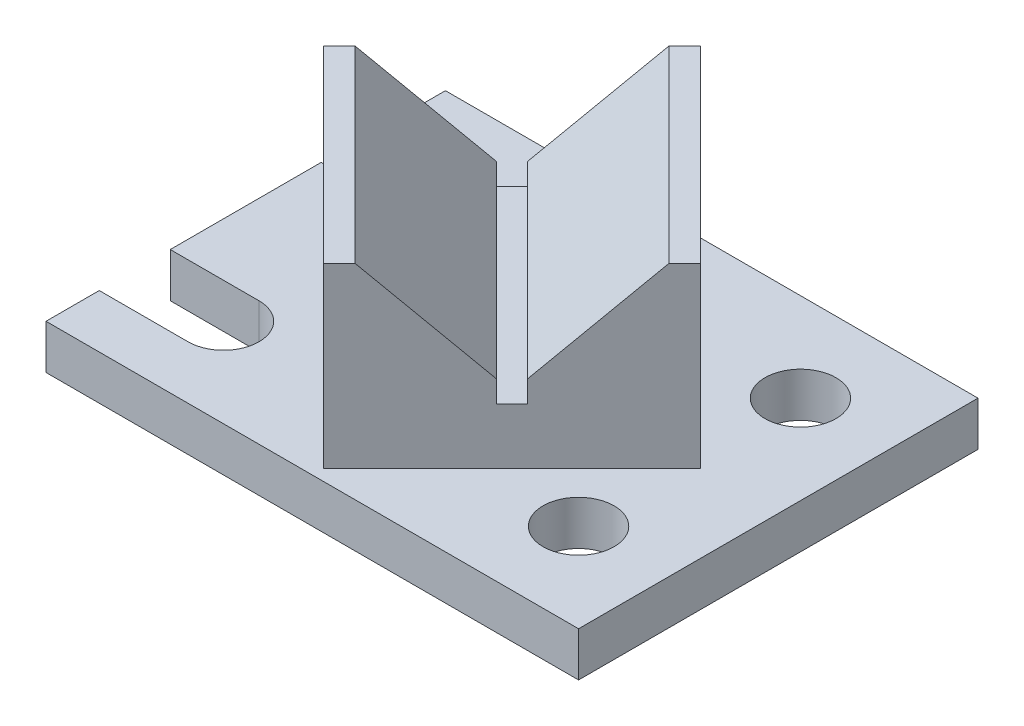
ISO-10303-21;
HEADER;
FILE_DESCRIPTION(('STEP AP214'),'2;1');
FILE_NAME('part.step','',(''),(''),'','','');
FILE_SCHEMA(('AUTOMOTIVE_DESIGN { 1 0 10303 214 1 1 1 1 }'));
ENDSEC;
DATA;
#1=APPLICATION_CONTEXT('core data for automotive mechanical design processes');
#2=APPLICATION_PROTOCOL_DEFINITION('international standard','automotive_design',2000,#1);
#3=PRODUCT_CONTEXT('',#1,'mechanical');
#4=PRODUCT('Part','Part','',(#3));
#5=PRODUCT_RELATED_PRODUCT_CATEGORY('part','',(#4));
#6=PRODUCT_DEFINITION_FORMATION('','',#4);
#7=PRODUCT_DEFINITION_CONTEXT('part definition',#1,'design');
#8=PRODUCT_DEFINITION('design','',#6,#7);
#9=PRODUCT_DEFINITION_SHAPE('','',#8);
#10=(LENGTH_UNIT() NAMED_UNIT(*) SI_UNIT(.MILLI.,.METRE.));
#11=(NAMED_UNIT(*) PLANE_ANGLE_UNIT() SI_UNIT($,.RADIAN.));
#12=(NAMED_UNIT(*) SI_UNIT($,.STERADIAN.) SOLID_ANGLE_UNIT());
#13=UNCERTAINTY_MEASURE_WITH_UNIT(LENGTH_MEASURE(1.E-05),#10,'distance_accuracy_value','');
#14=(GEOMETRIC_REPRESENTATION_CONTEXT(3) GLOBAL_UNCERTAINTY_ASSIGNED_CONTEXT((#13)) GLOBAL_UNIT_ASSIGNED_CONTEXT((#10,
#11,#12)) REPRESENTATION_CONTEXT('',''));
#15=CARTESIAN_POINT('',(0.,0.,0.));
#16=DIRECTION('',(0.,0.,1.));
#17=DIRECTION('',(1.,0.,0.));
#18=AXIS2_PLACEMENT_3D('',#15,#16,#17);
#19=CARTESIAN_POINT('',(0.,63.5,0.));
#20=DIRECTION('',(0.,-1.,0.));
#21=DIRECTION('',(0.,0.,-1.));
#22=AXIS2_PLACEMENT_3D('',#19,#20,#21);
#23=PLANE('',#22);
#24=DIRECTION('',(0.707106781186546,0.,-0.707106781186549));
#25=VECTOR('',#24,1.);
#26=CARTESIAN_POINT('',(1.04083408558608E-13,63.5,53.8815367264149));
#27=LINE('',#26,#25);
#28=CARTESIAN_POINT('',(1.04083408558608E-13,63.5,53.8815367264149));
#29=VERTEX_POINT('',#28);
#30=CARTESIAN_POINT('',(4.49012806053468,63.5,49.3914086658803));
#31=VERTEX_POINT('',#30);
#32=EDGE_CURVE('E246',#29,#31,#27,.T.);
#33=ORIENTED_EDGE('',*,*,#32,.T.);
#34=DIRECTION('',(-0.707106781186549,0.,-0.707106781186546));
#35=VECTOR('',#34,1.);
#36=CARTESIAN_POINT('',(-22.4506403026728,63.5,22.4506403026729));
#37=LINE('',#36,#35);
#38=CARTESIAN_POINT('',(-49.3914086658803,63.5,-4.4901280605345));
#39=VERTEX_POINT('',#38);
#40=EDGE_CURVE('E11',#31,#39,#37,.T.);
#41=ORIENTED_EDGE('',*,*,#40,.T.);
#42=DIRECTION('',(-0.707106781186546,0.,0.707106781186549));
#43=VECTOR('',#42,1.);
#44=CARTESIAN_POINT('',(-53.8815367264149,63.5,0.));
#45=LINE('',#44,#43);
#46=CARTESIAN_POINT('',(-53.8815367264149,63.5,0.));
#47=VERTEX_POINT('',#46);
#48=EDGE_CURVE('E238',#39,#47,#45,.T.);
#49=ORIENTED_EDGE('',*,*,#48,.T.);
#50=DIRECTION('',(0.707106781186549,0.,0.707106781186546));
#51=VECTOR('',#50,1.);
#52=CARTESIAN_POINT('',(1.04083408558608E-13,63.5,53.8815367264149));
#53=LINE('',#52,#51);
#54=EDGE_CURVE('E243',#47,#29,#53,.T.);
#55=ORIENTED_EDGE('',*,*,#54,.T.);
#56=EDGE_LOOP('',(#33,#41,#49,#55));
#57=FACE_BOUND('',#56,.T.);
#58=ADVANCED_FACE('F39',(#57),#23,.F.);
#59=CARTESIAN_POINT('',(0.,12.7,0.));
#60=DIRECTION('',(0.,-1.,0.));
#61=DIRECTION('',(0.,0.,-1.));
#62=AXIS2_PLACEMENT_3D('',#59,#60,#61);
#63=PLANE('',#62);
#64=CARTESIAN_POINT('',(50.8,12.7,-31.75));
#65=DIRECTION('',(0.,-1.,0.));
#66=DIRECTION('',(0.,0.,-1.));
#67=AXIS2_PLACEMENT_3D('',#64,#65,#66);
#68=CIRCLE('',#67,10.16);
#69=CARTESIAN_POINT('',(50.8,12.7,-41.91));
#70=VERTEX_POINT('',#69);
#71=EDGE_CURVE('E274',#70,#70,#68,.T.);
#72=ORIENTED_EDGE('',*,*,#71,.T.);
#73=EDGE_LOOP('',(#72));
#74=FACE_BOUND('',#73,.T.);
#75=DIRECTION('',(1.,0.,0.));
#76=VECTOR('',#75,1.);
#77=CARTESIAN_POINT('',(-76.2,12.7,-41.91));
#78=LINE('',#77,#76);
#79=CARTESIAN_POINT('',(-76.2,12.7,-41.91));
#80=VERTEX_POINT('',#79);
#81=CARTESIAN_POINT('',(-50.8,12.7,-41.91));
#82=VERTEX_POINT('',#81);
#83=EDGE_CURVE('E281',#80,#82,#78,.T.);
#84=ORIENTED_EDGE('',*,*,#83,.T.);
#85=CARTESIAN_POINT('',(-50.8,12.7,-31.75));
#86=DIRECTION('',(0.,-1.,0.));
#87=DIRECTION('',(0.,0.,1.));
#88=AXIS2_PLACEMENT_3D('',#85,#86,#87);
#89=CIRCLE('',#88,10.16);
#90=CARTESIAN_POINT('',(-50.8,12.7,-21.59));
#91=VERTEX_POINT('',#90);
#92=EDGE_CURVE('E289',#82,#91,#89,.T.);
#93=ORIENTED_EDGE('',*,*,#92,.T.);
#94=DIRECTION('',(-1.,0.,0.));
#95=VECTOR('',#94,1.);
#96=CARTESIAN_POINT('',(-76.2,12.7,-21.59));
#97=LINE('',#96,#95);
#98=CARTESIAN_POINT('',(-76.2,12.7,-21.59));
#99=VERTEX_POINT('',#98);
#100=EDGE_CURVE('E269',#91,#99,#97,.T.);
#101=ORIENTED_EDGE('',*,*,#100,.T.);
#102=DIRECTION('',(0.,0.,1.));
#103=VECTOR('',#102,1.);
#104=CARTESIAN_POINT('',(-76.2,12.7,57.15));
#105=LINE('',#104,#103);
#106=CARTESIAN_POINT('',(-76.2,12.7,21.59));
#107=VERTEX_POINT('',#106);
#108=EDGE_CURVE('E345',#99,#107,#105,.T.);
#109=ORIENTED_EDGE('',*,*,#108,.T.);
#110=DIRECTION('',(-1.,0.,0.));
#111=VECTOR('',#110,1.);
#112=CARTESIAN_POINT('',(-76.2,12.7,21.59));
#113=LINE('',#112,#111);
#114=CARTESIAN_POINT('',(-50.8,12.7,21.59));
#115=VERTEX_POINT('',#114);
#116=EDGE_CURVE('E318',#115,#107,#113,.T.);
#117=ORIENTED_EDGE('',*,*,#116,.F.);
#118=CARTESIAN_POINT('',(-50.8,12.7,31.75));
#119=DIRECTION('',(0.,1.,0.));
#120=DIRECTION('',(0.,0.,-1.));
#121=AXIS2_PLACEMENT_3D('',#118,#119,#120);
#122=CIRCLE('',#121,10.16);
#123=CARTESIAN_POINT('',(-50.8,12.7,41.91));
#124=VERTEX_POINT('',#123);
#125=EDGE_CURVE('E321',#124,#115,#122,.T.);
#126=ORIENTED_EDGE('',*,*,#125,.F.);
#127=DIRECTION('',(1.,0.,0.));
#128=VECTOR('',#127,1.);
#129=CARTESIAN_POINT('',(-76.2,12.7,41.91));
#130=LINE('',#129,#128);
#131=CARTESIAN_POINT('',(-76.2,12.7,41.91));
#132=VERTEX_POINT('',#131);
#133=EDGE_CURVE('E308',#132,#124,#130,.T.);
#134=ORIENTED_EDGE('',*,*,#133,.F.);
#135=CARTESIAN_POINT('',(-76.2,12.7,57.15));
#136=VERTEX_POINT('',#135);
#137=EDGE_CURVE('E340',#132,#136,#105,.T.);
#138=ORIENTED_EDGE('',*,*,#137,.T.);
#139=DIRECTION('',(1.,0.,0.));
#140=VECTOR('',#139,1.);
#141=CARTESIAN_POINT('',(-76.2,12.7,57.15));
#142=LINE('',#141,#140);
#143=CARTESIAN_POINT('',(76.2,12.7,57.15));
#144=VERTEX_POINT('',#143);
#145=EDGE_CURVE('E344',#136,#144,#142,.T.);
#146=ORIENTED_EDGE('',*,*,#145,.T.);
#147=DIRECTION('',(0.,0.,-1.));
#148=VECTOR('',#147,1.);
#149=CARTESIAN_POINT('',(76.2,12.7,57.15));
#150=LINE('',#149,#148);
#151=CARTESIAN_POINT('',(76.2,12.7,-57.15));
#152=VERTEX_POINT('',#151);
#153=EDGE_CURVE('E334',#144,#152,#150,.T.);
#154=ORIENTED_EDGE('',*,*,#153,.T.);
#155=DIRECTION('',(-1.,0.,0.));
#156=VECTOR('',#155,1.);
#157=CARTESIAN_POINT('',(-76.2,12.7,-57.15));
#158=LINE('',#157,#156);
#159=CARTESIAN_POINT('',(-76.2,12.7,-57.15));
#160=VERTEX_POINT('',#159);
#161=EDGE_CURVE('E337',#152,#160,#158,.T.);
#162=ORIENTED_EDGE('',*,*,#161,.T.);
#163=EDGE_CURVE('E341',#160,#80,#105,.T.);
#164=ORIENTED_EDGE('',*,*,#163,.T.);
#165=EDGE_LOOP('',(#84,#93,#101,#109,#117,#126,#134,#138,#146,#154,#162,#164));
#166=FACE_BOUND('',#165,.T.);
#167=CARTESIAN_POINT('',(50.8,12.7,31.75));
#168=DIRECTION('',(0.,1.,0.));
#169=DIRECTION('',(0.,0.,1.));
#170=AXIS2_PLACEMENT_3D('',#167,#168,#169);
#171=CIRCLE('',#170,10.16);
#172=CARTESIAN_POINT('',(50.8,12.7,41.91));
#173=VERTEX_POINT('',#172);
#174=EDGE_CURVE('E305',#173,#173,#171,.T.);
#175=ORIENTED_EDGE('',*,*,#174,.F.);
#176=EDGE_LOOP('',(#175));
#177=FACE_BOUND('',#176,.T.);
#178=DIRECTION('',(-0.707106781186549,0.,-0.707106781186546));
#179=VECTOR('',#178,1.);
#180=CARTESIAN_POINT('',(53.8815367264149,12.7,0.));
#181=LINE('',#180,#179);
#182=CARTESIAN_POINT('',(53.8815367264149,12.7,0.));
#183=VERTEX_POINT('',#182);
#184=CARTESIAN_POINT('',(0.,12.7,-53.8815367264149));
#185=VERTEX_POINT('',#184);
#186=EDGE_CURVE('E62',#183,#185,#181,.T.);
#187=ORIENTED_EDGE('',*,*,#186,.F.);
#188=DIRECTION('',(0.707106781186546,0.,-0.707106781186549));
#189=VECTOR('',#188,1.);
#190=CARTESIAN_POINT('',(1.04083408558608E-13,12.7,53.8815367264149));
#191=LINE('',#190,#189);
#192=CARTESIAN_POINT('',(1.04083408558608E-13,12.7,53.8815367264149));
#193=VERTEX_POINT('',#192);
#194=EDGE_CURVE('E239',#193,#183,#191,.T.);
#195=ORIENTED_EDGE('',*,*,#194,.F.);
#196=DIRECTION('',(0.707106781186549,0.,0.707106781186546));
#197=VECTOR('',#196,1.);
#198=CARTESIAN_POINT('',(1.04083408558608E-13,12.7,53.8815367264149));
#199=LINE('',#198,#197);
#200=CARTESIAN_POINT('',(-53.8815367264149,12.7,0.));
#201=VERTEX_POINT('',#200);
#202=EDGE_CURVE('E254',#201,#193,#199,.T.);
#203=ORIENTED_EDGE('',*,*,#202,.F.);
#204=DIRECTION('',(-0.707106781186546,0.,0.707106781186549));
#205=VECTOR('',#204,1.);
#206=CARTESIAN_POINT('',(-53.8815367264149,12.7,0.));
#207=LINE('',#206,#205);
#208=EDGE_CURVE('E251',#185,#201,#207,.T.);
#209=ORIENTED_EDGE('',*,*,#208,.F.);
#210=EDGE_LOOP('',(#187,#195,#203,#209));
#211=FACE_BOUND('',#210,.T.);
#212=ADVANCED_FACE('F392',(#74,#166,#177,#211),#63,.F.);
#213=CARTESIAN_POINT('',(-76.2,12.7,57.15));
#214=DIRECTION('',(1.,0.,0.));
#215=DIRECTION('',(0.,0.,-1.));
#216=AXIS2_PLACEMENT_3D('',#213,#214,#215);
#217=PLANE('',#216);
#218=DIRECTION('',(0.,1.,0.));
#219=VECTOR('',#218,1.);
#220=CARTESIAN_POINT('',(-76.2,0.,-41.91));
#221=LINE('',#220,#219);
#222=CARTESIAN_POINT('',(-76.2,0.,-41.91));
#223=VERTEX_POINT('',#222);
#224=EDGE_CURVE('E277',#223,#80,#221,.T.);
#225=ORIENTED_EDGE('',*,*,#224,.T.);
#226=ORIENTED_EDGE('',*,*,#163,.F.);
#227=DIRECTION('',(0.,-1.,0.));
#228=VECTOR('',#227,1.);
#229=CARTESIAN_POINT('',(-76.2,12.7,-57.15));
#230=LINE('',#229,#228);
#231=CARTESIAN_POINT('',(-76.2,0.,-57.15));
#232=VERTEX_POINT('',#231);
#233=EDGE_CURVE('E363',#160,#232,#230,.T.);
#234=ORIENTED_EDGE('',*,*,#233,.T.);
#235=DIRECTION('',(0.,0.,1.));
#236=VECTOR('',#235,1.);
#237=CARTESIAN_POINT('',(-76.2,0.,57.15));
#238=LINE('',#237,#236);
#239=EDGE_CURVE('E353',#232,#223,#238,.T.);
#240=ORIENTED_EDGE('',*,*,#239,.T.);
#241=EDGE_LOOP('',(#225,#226,#234,#240));
#242=FACE_BOUND('',#241,.T.);
#243=ADVANCED_FACE('F394',(#242),#217,.F.);
#244=DIRECTION('',(0.,1.,0.));
#245=VECTOR('',#244,1.);
#246=CARTESIAN_POINT('',(-76.2,0.,-21.59));
#247=LINE('',#246,#245);
#248=CARTESIAN_POINT('',(-76.2,0.,-21.59));
#249=VERTEX_POINT('',#248);
#250=EDGE_CURVE('E286',#249,#99,#247,.T.);
#251=ORIENTED_EDGE('',*,*,#250,.F.);
#252=CARTESIAN_POINT('',(-76.2,0.,21.59));
#253=VERTEX_POINT('',#252);
#254=EDGE_CURVE('E356',#249,#253,#238,.T.);
#255=ORIENTED_EDGE('',*,*,#254,.T.);
#256=DIRECTION('',(0.,1.,0.));
#257=VECTOR('',#256,1.);
#258=CARTESIAN_POINT('',(-76.2,0.,21.59));
#259=LINE('',#258,#257);
#260=EDGE_CURVE('E273',#253,#107,#259,.T.);
#261=ORIENTED_EDGE('',*,*,#260,.T.);
#262=ORIENTED_EDGE('',*,*,#108,.F.);
#263=EDGE_LOOP('',(#251,#255,#261,#262));
#264=FACE_BOUND('',#263,.T.);
#265=ADVANCED_FACE('F402',(#264),#217,.F.);
#266=CARTESIAN_POINT('',(0.,0.,0.));
#267=DIRECTION('',(0.,-1.,0.));
#268=DIRECTION('',(0.,0.,-1.));
#269=AXIS2_PLACEMENT_3D('',#266,#267,#268);
#270=PLANE('',#269);
#271=CARTESIAN_POINT('',(-50.8,0.,-31.75));
#272=DIRECTION('',(0.,-1.,0.));
#273=DIRECTION('',(0.,0.,1.));
#274=AXIS2_PLACEMENT_3D('',#271,#272,#273);
#275=CIRCLE('',#274,10.16);
#276=CARTESIAN_POINT('',(-50.8,0.,-41.91));
#277=VERTEX_POINT('',#276);
#278=CARTESIAN_POINT('',(-50.8,0.,-21.59));
#279=VERTEX_POINT('',#278);
#280=EDGE_CURVE('E280',#277,#279,#275,.T.);
#281=ORIENTED_EDGE('',*,*,#280,.F.);
#282=DIRECTION('',(1.,0.,0.));
#283=VECTOR('',#282,1.);
#284=CARTESIAN_POINT('',(-76.2,0.,-41.91));
#285=LINE('',#284,#283);
#286=EDGE_CURVE('E284',#223,#277,#285,.T.);
#287=ORIENTED_EDGE('',*,*,#286,.F.);
#288=ORIENTED_EDGE('',*,*,#239,.F.);
#289=DIRECTION('',(-1.,0.,0.));
#290=VECTOR('',#289,1.);
#291=CARTESIAN_POINT('',(-76.2,0.,-57.15));
#292=LINE('',#291,#290);
#293=CARTESIAN_POINT('',(76.2,0.,-57.15));
#294=VERTEX_POINT('',#293);
#295=EDGE_CURVE('E350',#294,#232,#292,.T.);
#296=ORIENTED_EDGE('',*,*,#295,.F.);
#297=DIRECTION('',(0.,0.,-1.));
#298=VECTOR('',#297,1.);
#299=CARTESIAN_POINT('',(76.2,0.,57.15));
#300=LINE('',#299,#298);
#301=CARTESIAN_POINT('',(76.2,0.,57.15));
#302=VERTEX_POINT('',#301);
#303=EDGE_CURVE('E304',#302,#294,#300,.T.);
#304=ORIENTED_EDGE('',*,*,#303,.F.);
#305=DIRECTION('',(1.,0.,0.));
#306=VECTOR('',#305,1.);
#307=CARTESIAN_POINT('',(-76.2,0.,57.15));
#308=LINE('',#307,#306);
#309=CARTESIAN_POINT('',(-76.2,0.,57.15));
#310=VERTEX_POINT('',#309);
#311=EDGE_CURVE('E338',#310,#302,#308,.T.);
#312=ORIENTED_EDGE('',*,*,#311,.F.);
#313=CARTESIAN_POINT('',(-76.2,0.,41.91));
#314=VERTEX_POINT('',#313);
#315=EDGE_CURVE('E352',#314,#310,#238,.T.);
#316=ORIENTED_EDGE('',*,*,#315,.F.);
#317=DIRECTION('',(1.,0.,0.));
#318=VECTOR('',#317,1.);
#319=CARTESIAN_POINT('',(-76.2,0.,41.91));
#320=LINE('',#319,#318);
#321=CARTESIAN_POINT('',(-50.8,0.,41.91));
#322=VERTEX_POINT('',#321);
#323=EDGE_CURVE('E322',#314,#322,#320,.T.);
#324=ORIENTED_EDGE('',*,*,#323,.T.);
#325=CARTESIAN_POINT('',(-50.8,0.,31.75));
#326=DIRECTION('',(0.,1.,0.));
#327=DIRECTION('',(0.,0.,-1.));
#328=AXIS2_PLACEMENT_3D('',#325,#326,#327);
#329=CIRCLE('',#328,10.16);
#330=CARTESIAN_POINT('',(-50.8,0.,21.59));
#331=VERTEX_POINT('',#330);
#332=EDGE_CURVE('E329',#322,#331,#329,.T.);
#333=ORIENTED_EDGE('',*,*,#332,.T.);
#334=DIRECTION('',(-1.,0.,0.));
#335=VECTOR('',#334,1.);
#336=CARTESIAN_POINT('',(-76.2,0.,21.59));
#337=LINE('',#336,#335);
#338=EDGE_CURVE('E311',#331,#253,#337,.T.);
#339=ORIENTED_EDGE('',*,*,#338,.T.);
#340=ORIENTED_EDGE('',*,*,#254,.F.);
#341=DIRECTION('',(-1.,0.,0.));
#342=VECTOR('',#341,1.);
#343=CARTESIAN_POINT('',(-76.2,0.,-21.59));
#344=LINE('',#343,#342);
#345=EDGE_CURVE('E278',#279,#249,#344,.T.);
#346=ORIENTED_EDGE('',*,*,#345,.F.);
#347=EDGE_LOOP('',(#281,#287,#288,#296,#304,#312,#316,#324,#333,#339,#340,#346));
#348=FACE_BOUND('',#347,.T.);
#349=CARTESIAN_POINT('',(50.8,0.,31.75));
#350=DIRECTION('',(0.,1.,0.));
#351=DIRECTION('',(0.,0.,1.));
#352=AXIS2_PLACEMENT_3D('',#349,#350,#351);
#353=CIRCLE('',#352,10.16);
#354=CARTESIAN_POINT('',(50.8,0.,41.91));
#355=VERTEX_POINT('',#354);
#356=EDGE_CURVE('E301',#355,#355,#353,.T.);
#357=ORIENTED_EDGE('',*,*,#356,.T.);
#358=EDGE_LOOP('',(#357));
#359=FACE_BOUND('',#358,.T.);
#360=CARTESIAN_POINT('',(50.8,0.,-31.75));
#361=DIRECTION('',(0.,-1.,0.));
#362=DIRECTION('',(0.,0.,-1.));
#363=AXIS2_PLACEMENT_3D('',#360,#361,#362);
#364=CIRCLE('',#363,10.16);
#365=CARTESIAN_POINT('',(50.8,0.,-41.91));
#366=VERTEX_POINT('',#365);
#367=EDGE_CURVE('E270',#366,#366,#364,.T.);
#368=ORIENTED_EDGE('',*,*,#367,.F.);
#369=EDGE_LOOP('',(#368));
#370=FACE_BOUND('',#369,.T.);
#371=ADVANCED_FACE('F413',(#348,#359,#370),#270,.T.);
#372=CARTESIAN_POINT('',(76.2,12.7,57.15));
#373=DIRECTION('',(-1.,0.,0.));
#374=DIRECTION('',(0.,0.,1.));
#375=AXIS2_PLACEMENT_3D('',#372,#373,#374);
#376=PLANE('',#375);
#377=ORIENTED_EDGE('',*,*,#303,.T.);
#378=DIRECTION('',(0.,-1.,0.));
#379=VECTOR('',#378,1.);
#380=CARTESIAN_POINT('',(76.2,12.7,-57.15));
#381=LINE('',#380,#379);
#382=EDGE_CURVE('E366',#152,#294,#381,.T.);
#383=ORIENTED_EDGE('',*,*,#382,.F.);
#384=ORIENTED_EDGE('',*,*,#153,.F.);
#385=DIRECTION('',(0.,-1.,0.));
#386=VECTOR('',#385,1.);
#387=CARTESIAN_POINT('',(76.2,12.7,57.15));
#388=LINE('',#387,#386);
#389=EDGE_CURVE('E347',#144,#302,#388,.T.);
#390=ORIENTED_EDGE('',*,*,#389,.T.);
#391=EDGE_LOOP('',(#377,#383,#384,#390));
#392=FACE_BOUND('',#391,.T.);
#393=ADVANCED_FACE('F41',(#392),#376,.F.);
#394=CARTESIAN_POINT('',(-76.2,12.7,-57.15));
#395=DIRECTION('',(0.,0.,1.));
#396=DIRECTION('',(1.,0.,0.));
#397=AXIS2_PLACEMENT_3D('',#394,#395,#396);
#398=PLANE('',#397);
#399=ORIENTED_EDGE('',*,*,#295,.T.);
#400=ORIENTED_EDGE('',*,*,#233,.F.);
#401=ORIENTED_EDGE('',*,*,#161,.F.);
#402=ORIENTED_EDGE('',*,*,#382,.T.);
#403=EDGE_LOOP('',(#399,#400,#401,#402));
#404=FACE_BOUND('',#403,.T.);
#405=ADVANCED_FACE('F421',(#404),#398,.F.);
#406=ORIENTED_EDGE('',*,*,#137,.F.);
#407=DIRECTION('',(0.,1.,0.));
#408=VECTOR('',#407,1.);
#409=CARTESIAN_POINT('',(-76.2,0.,41.91));
#410=LINE('',#409,#408);
#411=EDGE_CURVE('E309',#314,#132,#410,.T.);
#412=ORIENTED_EDGE('',*,*,#411,.F.);
#413=ORIENTED_EDGE('',*,*,#315,.T.);
#414=DIRECTION('',(0.,-1.,0.));
#415=VECTOR('',#414,1.);
#416=CARTESIAN_POINT('',(-76.2,12.7,57.15));
#417=LINE('',#416,#415);
#418=EDGE_CURVE('E360',#136,#310,#417,.T.);
#419=ORIENTED_EDGE('',*,*,#418,.F.);
#420=EDGE_LOOP('',(#406,#412,#413,#419));
#421=FACE_BOUND('',#420,.T.);
#422=ADVANCED_FACE('F405',(#421),#217,.F.);
#423=CARTESIAN_POINT('',(-76.2,12.7,57.15));
#424=DIRECTION('',(0.,0.,-1.));
#425=DIRECTION('',(-1.,0.,0.));
#426=AXIS2_PLACEMENT_3D('',#423,#424,#425);
#427=PLANE('',#426);
#428=ORIENTED_EDGE('',*,*,#311,.T.);
#429=ORIENTED_EDGE('',*,*,#389,.F.);
#430=ORIENTED_EDGE('',*,*,#145,.F.);
#431=ORIENTED_EDGE('',*,*,#418,.T.);
#432=EDGE_LOOP('',(#428,#429,#430,#431));
#433=FACE_BOUND('',#432,.T.);
#434=ADVANCED_FACE('F417',(#433),#427,.F.);
#435=CARTESIAN_POINT('',(-76.2,0.,21.59));
#436=DIRECTION('',(0.,0.,-1.));
#437=DIRECTION('',(-1.,0.,0.));
#438=AXIS2_PLACEMENT_3D('',#435,#436,#437);
#439=PLANE('',#438);
#440=ORIENTED_EDGE('',*,*,#116,.T.);
#441=ORIENTED_EDGE('',*,*,#260,.F.);
#442=ORIENTED_EDGE('',*,*,#338,.F.);
#443=DIRECTION('',(0.,1.,0.));
#444=VECTOR('',#443,1.);
#445=CARTESIAN_POINT('',(-50.8,0.,21.59));
#446=LINE('',#445,#444);
#447=EDGE_CURVE('E314',#331,#115,#446,.T.);
#448=ORIENTED_EDGE('',*,*,#447,.T.);
#449=EDGE_LOOP('',(#440,#441,#442,#448));
#450=FACE_BOUND('',#449,.T.);
#451=ADVANCED_FACE('F411',(#450),#439,.F.);
#452=CARTESIAN_POINT('',(-50.8,0.,31.75));
#453=DIRECTION('',(0.,1.,0.));
#454=DIRECTION('',(0.,0.,1.));
#455=AXIS2_PLACEMENT_3D('',#452,#453,#454);
#456=CYLINDRICAL_SURFACE('',#455,10.16);
#457=ORIENTED_EDGE('',*,*,#125,.T.);
#458=ORIENTED_EDGE('',*,*,#447,.F.);
#459=ORIENTED_EDGE('',*,*,#332,.F.);
#460=DIRECTION('',(0.,1.,0.));
#461=VECTOR('',#460,1.);
#462=CARTESIAN_POINT('',(-50.8,0.,41.91));
#463=LINE('',#462,#461);
#464=EDGE_CURVE('E312',#322,#124,#463,.T.);
#465=ORIENTED_EDGE('',*,*,#464,.T.);
#466=EDGE_LOOP('',(#457,#458,#459,#465));
#467=FACE_BOUND('',#466,.T.);
#468=ADVANCED_FACE('F464',(#467),#456,.F.);
#469=CARTESIAN_POINT('',(-76.2,0.,41.91));
#470=DIRECTION('',(0.,0.,1.));
#471=DIRECTION('',(1.,0.,0.));
#472=AXIS2_PLACEMENT_3D('',#469,#470,#471);
#473=PLANE('',#472);
#474=ORIENTED_EDGE('',*,*,#133,.T.);
#475=ORIENTED_EDGE('',*,*,#464,.F.);
#476=ORIENTED_EDGE('',*,*,#323,.F.);
#477=ORIENTED_EDGE('',*,*,#411,.T.);
#478=EDGE_LOOP('',(#474,#475,#476,#477));
#479=FACE_BOUND('',#478,.T.);
#480=ADVANCED_FACE('F466',(#479),#473,.F.);
#481=CARTESIAN_POINT('',(50.8,0.,31.75));
#482=DIRECTION('',(0.,1.,0.));
#483=DIRECTION('',(0.,0.,1.));
#484=AXIS2_PLACEMENT_3D('',#481,#482,#483);
#485=CYLINDRICAL_SURFACE('',#484,10.16);
#486=ORIENTED_EDGE('',*,*,#356,.F.);
#487=EDGE_LOOP('',(#486));
#488=FACE_BOUND('',#487,.T.);
#489=ORIENTED_EDGE('',*,*,#174,.T.);
#490=EDGE_LOOP('',(#489));
#491=FACE_BOUND('',#490,.T.);
#492=ADVANCED_FACE('F482',(#488,#491),#485,.F.);
#493=CARTESIAN_POINT('',(-76.2,0.,-41.91));
#494=DIRECTION('',(0.,0.,1.));
#495=DIRECTION('',(1.,0.,0.));
#496=AXIS2_PLACEMENT_3D('',#493,#494,#495);
#497=PLANE('',#496);
#498=ORIENTED_EDGE('',*,*,#83,.F.);
#499=ORIENTED_EDGE('',*,*,#224,.F.);
#500=ORIENTED_EDGE('',*,*,#286,.T.);
#501=DIRECTION('',(0.,1.,0.));
#502=VECTOR('',#501,1.);
#503=CARTESIAN_POINT('',(-50.8,0.,-41.91));
#504=LINE('',#503,#502);
#505=EDGE_CURVE('E296',#277,#82,#504,.T.);
#506=ORIENTED_EDGE('',*,*,#505,.T.);
#507=EDGE_LOOP('',(#498,#499,#500,#506));
#508=FACE_BOUND('',#507,.T.);
#509=ADVANCED_FACE('F440',(#508),#497,.T.);
#510=CARTESIAN_POINT('',(-50.8,0.,-31.75));
#511=DIRECTION('',(0.,1.,0.));
#512=DIRECTION('',(0.,0.,1.));
#513=AXIS2_PLACEMENT_3D('',#510,#511,#512);
#514=CYLINDRICAL_SURFACE('',#513,10.16);
#515=ORIENTED_EDGE('',*,*,#92,.F.);
#516=ORIENTED_EDGE('',*,*,#505,.F.);
#517=ORIENTED_EDGE('',*,*,#280,.T.);
#518=DIRECTION('',(0.,1.,0.));
#519=VECTOR('',#518,1.);
#520=CARTESIAN_POINT('',(-50.8,0.,-21.59));
#521=LINE('',#520,#519);
#522=EDGE_CURVE('E298',#279,#91,#521,.T.);
#523=ORIENTED_EDGE('',*,*,#522,.T.);
#524=EDGE_LOOP('',(#515,#516,#517,#523));
#525=FACE_BOUND('',#524,.T.);
#526=ADVANCED_FACE('F443',(#525),#514,.F.);
#527=CARTESIAN_POINT('',(-76.2,0.,-21.59));
#528=DIRECTION('',(0.,0.,-1.));
#529=DIRECTION('',(-1.,0.,0.));
#530=AXIS2_PLACEMENT_3D('',#527,#528,#529);
#531=PLANE('',#530);
#532=ORIENTED_EDGE('',*,*,#100,.F.);
#533=ORIENTED_EDGE('',*,*,#522,.F.);
#534=ORIENTED_EDGE('',*,*,#345,.T.);
#535=ORIENTED_EDGE('',*,*,#250,.T.);
#536=EDGE_LOOP('',(#532,#533,#534,#535));
#537=FACE_BOUND('',#536,.T.);
#538=ADVANCED_FACE('F470',(#537),#531,.T.);
#539=CARTESIAN_POINT('',(50.8,0.,-31.75));
#540=DIRECTION('',(0.,1.,0.));
#541=DIRECTION('',(0.,0.,1.));
#542=AXIS2_PLACEMENT_3D('',#539,#540,#541);
#543=CYLINDRICAL_SURFACE('',#542,10.16);
#544=ORIENTED_EDGE('',*,*,#367,.T.);
#545=EDGE_LOOP('',(#544));
#546=FACE_BOUND('',#545,.T.);
#547=ORIENTED_EDGE('',*,*,#71,.F.);
#548=EDGE_LOOP('',(#547));
#549=FACE_BOUND('',#548,.T.);
#550=ADVANCED_FACE('F472',(#546,#549),#543,.F.);
#551=CARTESIAN_POINT('',(53.8815367264149,63.5,0.));
#552=DIRECTION('',(-0.707106781186546,0.,0.707106781186549));
#553=DIRECTION('',(0.707106781186549,0.,0.707106781186546));
#554=AXIS2_PLACEMENT_3D('',#551,#552,#553);
#555=PLANE('',#554);
#556=ORIENTED_EDGE('',*,*,#186,.T.);
#557=DIRECTION('',(0.,-1.,0.));
#558=VECTOR('',#557,1.);
#559=CARTESIAN_POINT('',(0.,63.5,-53.8815367264149));
#560=LINE('',#559,#558);
#561=CARTESIAN_POINT('',(0.,63.5,-53.8815367264149));
#562=VERTEX_POINT('',#561);
#563=EDGE_CURVE('E266',#562,#185,#560,.T.);
#564=ORIENTED_EDGE('',*,*,#563,.F.);
#565=DIRECTION('',(-0.707106781186549,0.,-0.707106781186546));
#566=VECTOR('',#565,1.);
#567=CARTESIAN_POINT('',(53.8815367264149,63.5,0.));
#568=LINE('',#567,#566);
#569=CARTESIAN_POINT('',(53.8815367264149,63.5,0.));
#570=VERTEX_POINT('',#569);
#571=EDGE_CURVE('E235',#570,#562,#568,.T.);
#572=ORIENTED_EDGE('',*,*,#571,.F.);
#573=DIRECTION('',(0.,-1.,0.));
#574=VECTOR('',#573,1.);
#575=CARTESIAN_POINT('',(53.8815367264149,63.5,0.));
#576=LINE('',#575,#574);
#577=EDGE_CURVE('E249',#570,#183,#576,.T.);
#578=ORIENTED_EDGE('',*,*,#577,.T.);
#579=EDGE_LOOP('',(#556,#564,#572,#578));
#580=FACE_BOUND('',#579,.T.);
#581=ADVANCED_FACE('F375',(#580),#555,.F.);
#582=CARTESIAN_POINT('',(-53.8815367264149,63.5,0.));
#583=DIRECTION('',(0.707106781186549,0.,0.707106781186546));
#584=DIRECTION('',(0.707106781186546,0.,-0.707106781186549));
#585=AXIS2_PLACEMENT_3D('',#582,#583,#584);
#586=PLANE('',#585);
#587=ORIENTED_EDGE('',*,*,#48,.F.);
#588=DIRECTION('',(0.5,-0.707106781186546,-0.500000000000002));
#589=VECTOR('',#588,1.);
#590=CARTESIAN_POINT('',(-51.6364726961476,66.675,-2.2450640302672));
#591=LINE('',#590,#589);
#592=CARTESIAN_POINT('',(-29.1858323934748,34.9250000000001,-24.6957043329401));
#593=VERTEX_POINT('',#592);
#594=EDGE_CURVE('E226',#39,#593,#591,.T.);
#595=ORIENTED_EDGE('',*,*,#594,.T.);
#596=DIRECTION('',(0.,-1.,0.));
#597=VECTOR('',#596,1.);
#598=CARTESIAN_POINT('',(-29.1858323934748,63.5,-24.6957043329401));
#599=LINE('',#598,#597);
#600=CARTESIAN_POINT('',(-29.1858323934748,28.702,-24.6957043329401));
#601=VERTEX_POINT('',#600);
#602=EDGE_CURVE('E233',#593,#601,#599,.T.);
#603=ORIENTED_EDGE('',*,*,#602,.T.);
#604=DIRECTION('',(0.707106781186546,0.,-0.707106781186549));
#605=VECTOR('',#604,1.);
#606=CARTESIAN_POINT('',(-53.8815367264149,28.702,0.));
#607=LINE('',#606,#605);
#608=CARTESIAN_POINT('',(-24.6957043329402,28.702,-29.1858323934747));
#609=VERTEX_POINT('',#608);
#610=EDGE_CURVE('E196',#601,#609,#607,.T.);
#611=ORIENTED_EDGE('',*,*,#610,.T.);
#612=DIRECTION('',(0.,1.,0.));
#613=VECTOR('',#612,1.);
#614=CARTESIAN_POINT('',(-24.6957043329402,63.5,-29.1858323934747));
#615=LINE('',#614,#613);
#616=CARTESIAN_POINT('',(-24.6957043329402,34.9250000000001,-29.1858323934747));
#617=VERTEX_POINT('',#616);
#618=EDGE_CURVE('E230',#609,#617,#615,.T.);
#619=ORIENTED_EDGE('',*,*,#618,.T.);
#620=DIRECTION('',(0.5,0.707106781186547,-0.500000000000002));
#621=VECTOR('',#620,1.);
#622=CARTESIAN_POINT('',(-29.1858323934749,28.575,-24.6957043329401));
#623=LINE('',#622,#621);
#624=CARTESIAN_POINT('',(-4.49012806053466,63.5,-49.3914086658803));
#625=VERTEX_POINT('',#624);
#626=EDGE_CURVE('E220',#617,#625,#623,.T.);
#627=ORIENTED_EDGE('',*,*,#626,.T.);
#628=EDGE_CURVE('E240',#562,#625,#45,.T.);
#629=ORIENTED_EDGE('',*,*,#628,.F.);
#630=ORIENTED_EDGE('',*,*,#563,.T.);
#631=ORIENTED_EDGE('',*,*,#208,.T.);
#632=DIRECTION('',(0.,-1.,0.));
#633=VECTOR('',#632,1.);
#634=CARTESIAN_POINT('',(-53.8815367264149,63.5,0.));
#635=LINE('',#634,#633);
#636=EDGE_CURVE('E263',#47,#201,#635,.T.);
#637=ORIENTED_EDGE('',*,*,#636,.F.);
#638=EDGE_LOOP('',(#587,#595,#603,#611,#619,#627,#629,#630,#631,#637));
#639=FACE_BOUND('',#638,.T.);
#640=ADVANCED_FACE('F378',(#639),#586,.F.);
#641=CARTESIAN_POINT('',(1.04083408558608E-13,63.5,53.8815367264149));
#642=DIRECTION('',(0.707106781186546,0.,-0.707106781186549));
#643=DIRECTION('',(-0.707106781186549,0.,-0.707106781186546));
#644=AXIS2_PLACEMENT_3D('',#641,#642,#643);
#645=PLANE('',#644);
#646=ORIENTED_EDGE('',*,*,#202,.T.);
#647=DIRECTION('',(0.,-1.,0.));
#648=VECTOR('',#647,1.);
#649=CARTESIAN_POINT('',(1.04083408558608E-13,63.5,53.8815367264149));
#650=LINE('',#649,#648);
#651=EDGE_CURVE('E260',#29,#193,#650,.T.);
#652=ORIENTED_EDGE('',*,*,#651,.F.);
#653=ORIENTED_EDGE('',*,*,#54,.F.);
#654=ORIENTED_EDGE('',*,*,#636,.T.);
#655=EDGE_LOOP('',(#646,#652,#653,#654));
#656=FACE_BOUND('',#655,.T.);
#657=ADVANCED_FACE('F391',(#656),#645,.F.);
#658=CARTESIAN_POINT('',(1.04083408558608E-13,63.5,53.8815367264149));
#659=DIRECTION('',(-0.707106781186549,0.,-0.707106781186546));
#660=DIRECTION('',(-0.707106781186546,0.,0.707106781186549));
#661=AXIS2_PLACEMENT_3D('',#658,#659,#660);
#662=PLANE('',#661);
#663=DIRECTION('',(0.,-1.,0.));
#664=VECTOR('',#663,1.);
#665=CARTESIAN_POINT('',(24.6957043329402,34.9250000000001,29.1858323934747));
#666=LINE('',#665,#664);
#667=CARTESIAN_POINT('',(24.6957043329402,34.9250000000001,29.1858323934747));
#668=VERTEX_POINT('',#667);
#669=CARTESIAN_POINT('',(24.6957043329402,28.702,29.1858323934747));
#670=VERTEX_POINT('',#669);
#671=EDGE_CURVE('E203',#668,#670,#666,.T.);
#672=ORIENTED_EDGE('',*,*,#671,.F.);
#673=DIRECTION('',(0.5,-0.707106781186547,-0.500000000000002));
#674=VECTOR('',#673,1.);
#675=CARTESIAN_POINT('',(4.49012806053468,63.5,49.3914086658803));
#676=LINE('',#675,#674);
#677=EDGE_CURVE('E200',#31,#668,#676,.T.);
#678=ORIENTED_EDGE('',*,*,#677,.F.);
#679=ORIENTED_EDGE('',*,*,#32,.F.);
#680=ORIENTED_EDGE('',*,*,#651,.T.);
#681=ORIENTED_EDGE('',*,*,#194,.T.);
#682=ORIENTED_EDGE('',*,*,#577,.F.);
#683=CARTESIAN_POINT('',(49.3914086658804,63.5,4.4901280605345));
#684=VERTEX_POINT('',#683);
#685=EDGE_CURVE('E245',#684,#570,#27,.T.);
#686=ORIENTED_EDGE('',*,*,#685,.F.);
#687=DIRECTION('',(0.5,0.707106781186547,-0.500000000000001));
#688=VECTOR('',#687,1.);
#689=CARTESIAN_POINT('',(49.3914086658804,63.5,4.49012806053451));
#690=LINE('',#689,#688);
#691=CARTESIAN_POINT('',(29.1858323934748,34.9250000000001,24.6957043329401));
#692=VERTEX_POINT('',#691);
#693=EDGE_CURVE('E54',#692,#684,#690,.T.);
#694=ORIENTED_EDGE('',*,*,#693,.F.);
#695=DIRECTION('',(0.,1.,0.));
#696=VECTOR('',#695,1.);
#697=CARTESIAN_POINT('',(29.1858323934748,34.9250000000001,24.6957043329401));
#698=LINE('',#697,#696);
#699=CARTESIAN_POINT('',(29.1858323934748,28.702,24.6957043329401));
#700=VERTEX_POINT('',#699);
#701=EDGE_CURVE('E213',#700,#692,#698,.T.);
#702=ORIENTED_EDGE('',*,*,#701,.F.);
#703=DIRECTION('',(0.707106781186546,0.,-0.707106781186549));
#704=VECTOR('',#703,1.);
#705=CARTESIAN_POINT('',(29.1858323934748,28.702,24.6957043329401));
#706=LINE('',#705,#704);
#707=EDGE_CURVE('E193',#670,#700,#706,.T.);
#708=ORIENTED_EDGE('',*,*,#707,.F.);
#709=EDGE_LOOP('',(#672,#678,#679,#680,#681,#682,#686,#694,#702,#708));
#710=FACE_BOUND('',#709,.T.);
#711=ADVANCED_FACE('F211',(#710),#662,.F.);
#712=ORIENTED_EDGE('',*,*,#628,.T.);
#713=DIRECTION('',(0.707106781186549,0.,0.707106781186546));
#714=VECTOR('',#713,1.);
#715=CARTESIAN_POINT('',(22.4506403026728,63.5,-22.4506403026729));
#716=LINE('',#715,#714);
#717=EDGE_CURVE('E47',#625,#684,#716,.T.);
#718=ORIENTED_EDGE('',*,*,#717,.T.);
#719=ORIENTED_EDGE('',*,*,#685,.T.);
#720=ORIENTED_EDGE('',*,*,#571,.T.);
#721=EDGE_LOOP('',(#712,#718,#719,#720));
#722=FACE_BOUND('',#721,.T.);
#723=ADVANCED_FACE('F370',(#722),#23,.F.);
#724=CARTESIAN_POINT('',(-68.9200640302674,34.9250000000001,-64.4299359697326));
#725=DIRECTION('',(-0.707106781186546,0.,0.707106781186549));
#726=DIRECTION('',(0.707106781186549,0.,0.707106781186546));
#727=AXIS2_PLACEMENT_3D('',#724,#725,#726);
#728=PLANE('',#727);
#729=DIRECTION('',(0.707106781186549,0.,0.707106781186546));
#730=VECTOR('',#729,1.);
#731=CARTESIAN_POINT('',(-68.9200640302674,34.9250000000001,-64.4299359697326));
#732=LINE('',#731,#730);
#733=EDGE_CURVE('E206',#593,#668,#732,.T.);
#734=ORIENTED_EDGE('',*,*,#733,.T.);
#735=ORIENTED_EDGE('',*,*,#671,.T.);
#736=DIRECTION('',(0.707106781186549,0.,0.707106781186546));
#737=VECTOR('',#736,1.);
#738=CARTESIAN_POINT('',(-68.9200640302674,28.702,-64.4299359697326));
#739=LINE('',#738,#737);
#740=EDGE_CURVE('E188',#601,#670,#739,.T.);
#741=ORIENTED_EDGE('',*,*,#740,.F.);
#742=ORIENTED_EDGE('',*,*,#602,.F.);
#743=EDGE_LOOP('',(#734,#735,#741,#742));
#744=FACE_BOUND('',#743,.T.);
#745=ADVANCED_FACE('F204',(#744),#728,.F.);
#746=CARTESIAN_POINT('',(-64.4299359697328,34.9250000000001,-68.9200640302672));
#747=DIRECTION('',(0.707106781186546,0.,-0.707106781186549));
#748=DIRECTION('',(-0.707106781186549,0.,-0.707106781186546));
#749=AXIS2_PLACEMENT_3D('',#746,#747,#748);
#750=PLANE('',#749);
#751=DIRECTION('',(0.707106781186549,0.,0.707106781186546));
#752=VECTOR('',#751,1.);
#753=CARTESIAN_POINT('',(-64.4299359697328,28.702,-68.9200640302672));
#754=LINE('',#753,#752);
#755=EDGE_CURVE('E199',#609,#700,#754,.T.);
#756=ORIENTED_EDGE('',*,*,#755,.T.);
#757=ORIENTED_EDGE('',*,*,#701,.T.);
#758=DIRECTION('',(0.707106781186549,0.,0.707106781186546));
#759=VECTOR('',#758,1.);
#760=CARTESIAN_POINT('',(-64.4299359697328,34.9250000000001,-68.9200640302672));
#761=LINE('',#760,#759);
#762=EDGE_CURVE('E221',#617,#692,#761,.T.);
#763=ORIENTED_EDGE('',*,*,#762,.F.);
#764=ORIENTED_EDGE('',*,*,#618,.F.);
#765=EDGE_LOOP('',(#756,#757,#763,#764));
#766=FACE_BOUND('',#765,.T.);
#767=ADVANCED_FACE('F383',(#766),#750,.F.);
#768=CARTESIAN_POINT('',(-64.4299359697328,28.702,-68.9200640302672));
#769=DIRECTION('',(0.,-1.,0.));
#770=DIRECTION('',(0.,0.,-1.));
#771=AXIS2_PLACEMENT_3D('',#768,#769,#770);
#772=PLANE('',#771);
#773=ORIENTED_EDGE('',*,*,#740,.T.);
#774=ORIENTED_EDGE('',*,*,#707,.T.);
#775=ORIENTED_EDGE('',*,*,#755,.F.);
#776=ORIENTED_EDGE('',*,*,#610,.F.);
#777=EDGE_LOOP('',(#773,#774,#775,#776));
#778=FACE_BOUND('',#777,.T.);
#779=ADVANCED_FACE('F190',(#778),#772,.F.);
#780=CARTESIAN_POINT('',(-89.125640302673,63.5,-44.224359697327));
#781=DIRECTION('',(-0.499999999999998,-0.707106781186549,0.5));
#782=DIRECTION('',(0.,-0.577350269189625,-0.816496580927726));
#783=AXIS2_PLACEMENT_3D('',#780,#781,#782);
#784=PLANE('',#783);
#785=ORIENTED_EDGE('',*,*,#40,.F.);
#786=ORIENTED_EDGE('',*,*,#677,.T.);
#787=ORIENTED_EDGE('',*,*,#733,.F.);
#788=ORIENTED_EDGE('',*,*,#594,.F.);
#789=EDGE_LOOP('',(#785,#786,#787,#788));
#790=FACE_BOUND('',#789,.T.);
#791=ADVANCED_FACE('F385',(#790),#784,.F.);
#792=CARTESIAN_POINT('',(-44.2243596973273,63.5,-89.1256403026728));
#793=DIRECTION('',(0.499999999999999,-0.707106781186548,-0.5));
#794=DIRECTION('',(0.,0.577350269189625,-0.816496580927726));
#795=AXIS2_PLACEMENT_3D('',#792,#793,#794);
#796=PLANE('',#795);
#797=ORIENTED_EDGE('',*,*,#762,.T.);
#798=ORIENTED_EDGE('',*,*,#693,.T.);
#799=ORIENTED_EDGE('',*,*,#717,.F.);
#800=ORIENTED_EDGE('',*,*,#626,.F.);
#801=EDGE_LOOP('',(#797,#798,#799,#800));
#802=FACE_BOUND('',#801,.T.);
#803=ADVANCED_FACE('F381',(#802),#796,.F.);
#804=CLOSED_SHELL('',(#58,#212,#243,#265,#371,#393,#405,#422,#434,#451,#468,#480,#492,#509,#526,
#538,#550,#581,#640,#657,#711,#723,#745,#767,#779,#791,#803));
#805=MANIFOLD_SOLID_BREP('B2',#804);
#806=ADVANCED_BREP_SHAPE_REPRESENTATION('',(#18,#805),#14);
#807=SHAPE_DEFINITION_REPRESENTATION(#9,#806);
ENDSEC;
END-ISO-10303-21;
